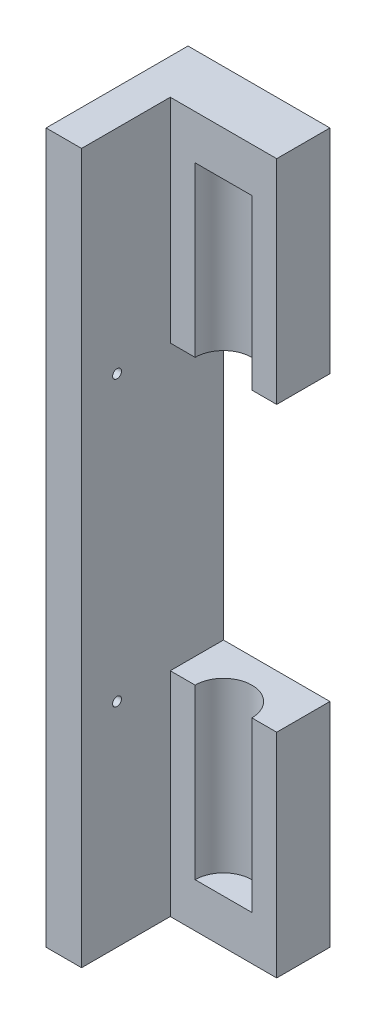
ISO-10303-21;
HEADER;
FILE_DESCRIPTION(('STEP AP214'),'2;1');
FILE_NAME('part.step','',(''),(''),'','','');
FILE_SCHEMA(('AUTOMOTIVE_DESIGN { 1 0 10303 214 1 1 1 1 }'));
ENDSEC;
DATA;
#1=APPLICATION_CONTEXT('core data for automotive mechanical design processes');
#2=APPLICATION_PROTOCOL_DEFINITION('international standard','automotive_design',2000,#1);
#3=PRODUCT_CONTEXT('',#1,'mechanical');
#4=PRODUCT('Part','Part','',(#3));
#5=PRODUCT_RELATED_PRODUCT_CATEGORY('part','',(#4));
#6=PRODUCT_DEFINITION_FORMATION('','',#4);
#7=PRODUCT_DEFINITION_CONTEXT('part definition',#1,'design');
#8=PRODUCT_DEFINITION('design','',#6,#7);
#9=PRODUCT_DEFINITION_SHAPE('','',#8);
#10=(LENGTH_UNIT() NAMED_UNIT(*) SI_UNIT(.MILLI.,.METRE.));
#11=(NAMED_UNIT(*) PLANE_ANGLE_UNIT() SI_UNIT($,.RADIAN.));
#12=(NAMED_UNIT(*) SI_UNIT($,.STERADIAN.) SOLID_ANGLE_UNIT());
#13=UNCERTAINTY_MEASURE_WITH_UNIT(LENGTH_MEASURE(1.E-05),#10,'distance_accuracy_value','');
#14=(GEOMETRIC_REPRESENTATION_CONTEXT(3) GLOBAL_UNCERTAINTY_ASSIGNED_CONTEXT((#13)) GLOBAL_UNIT_ASSIGNED_CONTEXT((#10,
#11,#12)) REPRESENTATION_CONTEXT('',''));
#15=CARTESIAN_POINT('',(0.,0.,0.));
#16=DIRECTION('',(0.,0.,1.));
#17=DIRECTION('',(1.,0.,0.));
#18=AXIS2_PLACEMENT_3D('',#15,#16,#17);
#19=CARTESIAN_POINT('',(30.,200.,0.));
#20=DIRECTION('',(0.,0.,-1.));
#21=DIRECTION('',(-1.,0.,0.));
#22=AXIS2_PLACEMENT_3D('',#19,#20,#21);
#23=PLANE('',#22);
#24=DIRECTION('',(1.,0.,0.));
#25=VECTOR('',#24,1.);
#26=CARTESIAN_POINT('',(30.,140.,0.));
#27=LINE('',#26,#25);
#28=CARTESIAN_POINT('',(23.,140.,0.));
#29=VERTEX_POINT('',#28);
#30=CARTESIAN_POINT('',(30.,140.,0.));
#31=VERTEX_POINT('',#30);
#32=EDGE_CURVE('E53',#29,#31,#27,.T.);
#33=ORIENTED_EDGE('',*,*,#32,.T.);
#34=DIRECTION('',(0.,-1.,0.));
#35=VECTOR('',#34,1.);
#36=CARTESIAN_POINT('',(30.,200.,0.));
#37=LINE('',#36,#35);
#38=CARTESIAN_POINT('',(30.,200.,0.));
#39=VERTEX_POINT('',#38);
#40=EDGE_CURVE('E162',#39,#31,#37,.T.);
#41=ORIENTED_EDGE('',*,*,#40,.F.);
#42=DIRECTION('',(1.,0.,0.));
#43=VECTOR('',#42,1.);
#44=CARTESIAN_POINT('',(30.,200.,0.));
#45=LINE('',#44,#43);
#46=CARTESIAN_POINT('',(0.,200.,0.));
#47=VERTEX_POINT('',#46);
#48=EDGE_CURVE('E206',#47,#39,#45,.T.);
#49=ORIENTED_EDGE('',*,*,#48,.F.);
#50=DIRECTION('',(0.,-1.,0.));
#51=VECTOR('',#50,1.);
#52=CARTESIAN_POINT('',(0.,200.,0.));
#53=LINE('',#52,#51);
#54=CARTESIAN_POINT('',(0.,140.,0.));
#55=VERTEX_POINT('',#54);
#56=EDGE_CURVE('E194',#47,#55,#53,.T.);
#57=ORIENTED_EDGE('',*,*,#56,.T.);
#58=CARTESIAN_POINT('',(7.00000000000001,140.,0.));
#59=VERTEX_POINT('',#58);
#60=EDGE_CURVE('E186',#55,#59,#27,.T.);
#61=ORIENTED_EDGE('',*,*,#60,.T.);
#62=DIRECTION('',(0.,1.,0.));
#63=VECTOR('',#62,1.);
#64=CARTESIAN_POINT('',(7.00000000000001,12.5,0.));
#65=LINE('',#64,#63);
#66=CARTESIAN_POINT('',(7.00000000000001,187.5,0.));
#67=VERTEX_POINT('',#66);
#68=EDGE_CURVE('E177',#59,#67,#65,.T.);
#69=ORIENTED_EDGE('',*,*,#68,.T.);
#70=DIRECTION('',(1.,0.,0.));
#71=VECTOR('',#70,1.);
#72=CARTESIAN_POINT('',(30.,187.5,0.));
#73=LINE('',#72,#71);
#74=CARTESIAN_POINT('',(23.,187.5,0.));
#75=VERTEX_POINT('',#74);
#76=EDGE_CURVE('E166',#67,#75,#73,.T.);
#77=ORIENTED_EDGE('',*,*,#76,.T.);
#78=DIRECTION('',(0.,1.,0.));
#79=VECTOR('',#78,1.);
#80=CARTESIAN_POINT('',(23.,12.5,0.));
#81=LINE('',#80,#79);
#82=EDGE_CURVE('E174',#75,#29,#81,.F.);
#83=ORIENTED_EDGE('',*,*,#82,.T.);
#84=EDGE_LOOP('',(#33,#41,#49,#57,#61,#69,#77,#83));
#85=FACE_BOUND('',#84,.T.);
#86=ADVANCED_FACE('F38',(#85),#23,.F.);
#87=CARTESIAN_POINT('',(30.,200.,-15.));
#88=DIRECTION('',(-1.,0.,0.));
#89=DIRECTION('',(0.,0.,1.));
#90=AXIS2_PLACEMENT_3D('',#87,#88,#89);
#91=PLANE('',#90);
#92=DIRECTION('',(0.,0.,-1.));
#93=VECTOR('',#92,1.);
#94=CARTESIAN_POINT('',(30.,140.,-15.));
#95=LINE('',#94,#93);
#96=CARTESIAN_POINT('',(30.,140.,-15.));
#97=VERTEX_POINT('',#96);
#98=EDGE_CURVE('E195',#31,#97,#95,.T.);
#99=ORIENTED_EDGE('',*,*,#98,.T.);
#100=DIRECTION('',(0.,-1.,0.));
#101=VECTOR('',#100,1.);
#102=CARTESIAN_POINT('',(30.,200.,-15.));
#103=LINE('',#102,#101);
#104=CARTESIAN_POINT('',(30.,200.,-15.));
#105=VERTEX_POINT('',#104);
#106=EDGE_CURVE('E163',#105,#97,#103,.T.);
#107=ORIENTED_EDGE('',*,*,#106,.F.);
#108=DIRECTION('',(0.,0.,-1.));
#109=VECTOR('',#108,1.);
#110=CARTESIAN_POINT('',(30.,200.,-15.));
#111=LINE('',#110,#109);
#112=EDGE_CURVE('E209',#39,#105,#111,.T.);
#113=ORIENTED_EDGE('',*,*,#112,.F.);
#114=ORIENTED_EDGE('',*,*,#40,.T.);
#115=EDGE_LOOP('',(#99,#107,#113,#114));
#116=FACE_BOUND('',#115,.T.);
#117=ADVANCED_FACE('F267',(#116),#91,.F.);
#118=CARTESIAN_POINT('',(15.,12.5,0.));
#119=DIRECTION('',(0.,1.,0.));
#120=DIRECTION('',(0.,0.,1.));
#121=AXIS2_PLACEMENT_3D('',#118,#119,#120);
#122=CYLINDRICAL_SURFACE('',#121,8.);
#123=CARTESIAN_POINT('',(15.,140.,0.));
#124=DIRECTION('',(0.,-1.,0.));
#125=DIRECTION('',(0.,0.,-1.));
#126=AXIS2_PLACEMENT_3D('',#123,#124,#125);
#127=CIRCLE('',#126,8.);
#128=EDGE_CURVE('E46',#29,#59,#127,.F.);
#129=ORIENTED_EDGE('',*,*,#128,.F.);
#130=ORIENTED_EDGE('',*,*,#82,.F.);
#131=CARTESIAN_POINT('',(15.,187.5,0.));
#132=DIRECTION('',(0.,1.,0.));
#133=DIRECTION('',(0.,0.,1.));
#134=AXIS2_PLACEMENT_3D('',#131,#132,#133);
#135=CIRCLE('',#134,8.);
#136=EDGE_CURVE('E60',#75,#67,#135,.T.);
#137=ORIENTED_EDGE('',*,*,#136,.T.);
#138=ORIENTED_EDGE('',*,*,#68,.F.);
#139=EDGE_LOOP('',(#129,#130,#137,#138));
#140=FACE_BOUND('',#139,.T.);
#141=ADVANCED_FACE('F197',(#140),#122,.F.);
#142=CARTESIAN_POINT('',(30.,60.,0.));
#143=VERTEX_POINT('',#142);
#144=CARTESIAN_POINT('',(30.,0.,0.));
#145=VERTEX_POINT('',#144);
#146=EDGE_CURVE('E154',#143,#145,#37,.T.);
#147=ORIENTED_EDGE('',*,*,#146,.F.);
#148=DIRECTION('',(1.,0.,0.));
#149=VECTOR('',#148,1.);
#150=CARTESIAN_POINT('',(30.,60.,0.));
#151=LINE('',#150,#149);
#152=CARTESIAN_POINT('',(23.,60.,0.));
#153=VERTEX_POINT('',#152);
#154=EDGE_CURVE('E139',#153,#143,#151,.T.);
#155=ORIENTED_EDGE('',*,*,#154,.F.);
#156=CARTESIAN_POINT('',(23.,12.5,0.));
#157=VERTEX_POINT('',#156);
#158=EDGE_CURVE('E173',#153,#157,#81,.F.);
#159=ORIENTED_EDGE('',*,*,#158,.T.);
#160=DIRECTION('',(1.,0.,0.));
#161=VECTOR('',#160,1.);
#162=CARTESIAN_POINT('',(30.,12.5,0.));
#163=LINE('',#162,#161);
#164=CARTESIAN_POINT('',(7.00000000000001,12.5,0.));
#165=VERTEX_POINT('',#164);
#166=EDGE_CURVE('E181',#165,#157,#163,.T.);
#167=ORIENTED_EDGE('',*,*,#166,.F.);
#168=CARTESIAN_POINT('',(7.00000000000001,60.,0.));
#169=VERTEX_POINT('',#168);
#170=EDGE_CURVE('E178',#165,#169,#65,.T.);
#171=ORIENTED_EDGE('',*,*,#170,.T.);
#172=CARTESIAN_POINT('',(0.,60.,0.));
#173=VERTEX_POINT('',#172);
#174=EDGE_CURVE('E147',#173,#169,#151,.T.);
#175=ORIENTED_EDGE('',*,*,#174,.F.);
#176=CARTESIAN_POINT('',(0.,0.,0.));
#177=VERTEX_POINT('',#176);
#178=EDGE_CURVE('E220',#173,#177,#53,.T.);
#179=ORIENTED_EDGE('',*,*,#178,.T.);
#180=DIRECTION('',(1.,0.,0.));
#181=VECTOR('',#180,1.);
#182=CARTESIAN_POINT('',(30.,0.,0.));
#183=LINE('',#182,#181);
#184=EDGE_CURVE('E161',#177,#145,#183,.T.);
#185=ORIENTED_EDGE('',*,*,#184,.T.);
#186=EDGE_LOOP('',(#147,#155,#159,#167,#171,#175,#179,#185));
#187=FACE_BOUND('',#186,.T.);
#188=ADVANCED_FACE('F40',(#187),#23,.F.);
#189=CARTESIAN_POINT('',(30.,60.,-15.));
#190=VERTEX_POINT('',#189);
#191=CARTESIAN_POINT('',(30.,0.,-15.));
#192=VERTEX_POINT('',#191);
#193=EDGE_CURVE('E156',#190,#192,#103,.T.);
#194=ORIENTED_EDGE('',*,*,#193,.F.);
#195=DIRECTION('',(0.,0.,-1.));
#196=VECTOR('',#195,1.);
#197=CARTESIAN_POINT('',(30.,60.,-15.));
#198=LINE('',#197,#196);
#199=EDGE_CURVE('E142',#143,#190,#198,.T.);
#200=ORIENTED_EDGE('',*,*,#199,.F.);
#201=ORIENTED_EDGE('',*,*,#146,.T.);
#202=DIRECTION('',(0.,0.,-1.));
#203=VECTOR('',#202,1.);
#204=CARTESIAN_POINT('',(30.,0.,-15.));
#205=LINE('',#204,#203);
#206=EDGE_CURVE('E222',#145,#192,#205,.T.);
#207=ORIENTED_EDGE('',*,*,#206,.T.);
#208=EDGE_LOOP('',(#194,#200,#201,#207));
#209=FACE_BOUND('',#208,.T.);
#210=ADVANCED_FACE('F152',(#209),#91,.F.);
#211=CARTESIAN_POINT('',(-10.,200.,-15.));
#212=DIRECTION('',(0.,0.,1.));
#213=DIRECTION('',(1.,0.,0.));
#214=AXIS2_PLACEMENT_3D('',#211,#212,#213);
#215=PLANE('',#214);
#216=DIRECTION('',(0.,1.,0.));
#217=VECTOR('',#216,1.);
#218=CARTESIAN_POINT('',(0.,60.,-15.));
#219=LINE('',#218,#217);
#220=CARTESIAN_POINT('',(0.,60.,-15.));
#221=VERTEX_POINT('',#220);
#222=CARTESIAN_POINT('',(0.,140.,-15.));
#223=VERTEX_POINT('',#222);
#224=EDGE_CURVE('E199',#221,#223,#219,.T.);
#225=ORIENTED_EDGE('',*,*,#224,.F.);
#226=DIRECTION('',(-1.,0.,0.));
#227=VECTOR('',#226,1.);
#228=CARTESIAN_POINT('',(0.,60.,-15.));
#229=LINE('',#228,#227);
#230=EDGE_CURVE('E157',#190,#221,#229,.T.);
#231=ORIENTED_EDGE('',*,*,#230,.F.);
#232=ORIENTED_EDGE('',*,*,#193,.T.);
#233=DIRECTION('',(-1.,0.,0.));
#234=VECTOR('',#233,1.);
#235=CARTESIAN_POINT('',(-10.,0.,-15.));
#236=LINE('',#235,#234);
#237=CARTESIAN_POINT('',(-10.,0.,-15.));
#238=VERTEX_POINT('',#237);
#239=EDGE_CURVE('E224',#192,#238,#236,.T.);
#240=ORIENTED_EDGE('',*,*,#239,.T.);
#241=DIRECTION('',(0.,-1.,0.));
#242=VECTOR('',#241,1.);
#243=CARTESIAN_POINT('',(-10.,200.,-15.));
#244=LINE('',#243,#242);
#245=CARTESIAN_POINT('',(-10.,200.,-15.));
#246=VERTEX_POINT('',#245);
#247=EDGE_CURVE('E238',#246,#238,#244,.T.);
#248=ORIENTED_EDGE('',*,*,#247,.F.);
#249=DIRECTION('',(-1.,0.,0.));
#250=VECTOR('',#249,1.);
#251=CARTESIAN_POINT('',(-10.,200.,-15.));
#252=LINE('',#251,#250);
#253=EDGE_CURVE('E212',#105,#246,#252,.T.);
#254=ORIENTED_EDGE('',*,*,#253,.F.);
#255=ORIENTED_EDGE('',*,*,#106,.T.);
#256=DIRECTION('',(-1.,0.,0.));
#257=VECTOR('',#256,1.);
#258=CARTESIAN_POINT('',(0.,140.,-15.));
#259=LINE('',#258,#257);
#260=EDGE_CURVE('E264',#97,#223,#259,.T.);
#261=ORIENTED_EDGE('',*,*,#260,.T.);
#262=EDGE_LOOP('',(#225,#231,#232,#240,#248,#254,#255,#261));
#263=FACE_BOUND('',#262,.T.);
#264=ADVANCED_FACE('F246',(#263),#215,.F.);
#265=CARTESIAN_POINT('',(-10.,200.,25.));
#266=DIRECTION('',(1.,0.,0.));
#267=DIRECTION('',(0.,0.,-1.));
#268=AXIS2_PLACEMENT_3D('',#265,#266,#267);
#269=PLANE('',#268);
#270=CARTESIAN_POINT('',(-10.,140.,15.));
#271=DIRECTION('',(1.,0.,0.));
#272=DIRECTION('',(0.,0.,-1.));
#273=AXIS2_PLACEMENT_3D('',#270,#271,#272);
#274=CIRCLE('',#273,1.25);
#275=CARTESIAN_POINT('',(-10.,140.,13.75));
#276=VERTEX_POINT('',#275);
#277=EDGE_CURVE('E286',#276,#276,#274,.T.);
#278=ORIENTED_EDGE('',*,*,#277,.T.);
#279=EDGE_LOOP('',(#278));
#280=FACE_BOUND('',#279,.T.);
#281=CARTESIAN_POINT('',(-10.,60.,15.));
#282=DIRECTION('',(1.,0.,0.));
#283=DIRECTION('',(0.,0.,-1.));
#284=AXIS2_PLACEMENT_3D('',#281,#282,#283);
#285=CIRCLE('',#284,1.25);
#286=CARTESIAN_POINT('',(-10.,60.,13.75));
#287=VERTEX_POINT('',#286);
#288=EDGE_CURVE('E280',#287,#287,#285,.T.);
#289=ORIENTED_EDGE('',*,*,#288,.T.);
#290=EDGE_LOOP('',(#289));
#291=FACE_BOUND('',#290,.T.);
#292=DIRECTION('',(0.,0.,1.));
#293=VECTOR('',#292,1.);
#294=CARTESIAN_POINT('',(-10.,0.,25.));
#295=LINE('',#294,#293);
#296=CARTESIAN_POINT('',(-10.,0.,25.));
#297=VERTEX_POINT('',#296);
#298=EDGE_CURVE('E226',#238,#297,#295,.T.);
#299=ORIENTED_EDGE('',*,*,#298,.T.);
#300=DIRECTION('',(0.,-1.,0.));
#301=VECTOR('',#300,1.);
#302=CARTESIAN_POINT('',(-10.,200.,25.));
#303=LINE('',#302,#301);
#304=CARTESIAN_POINT('',(-10.,200.,25.));
#305=VERTEX_POINT('',#304);
#306=EDGE_CURVE('E236',#305,#297,#303,.T.);
#307=ORIENTED_EDGE('',*,*,#306,.F.);
#308=DIRECTION('',(0.,0.,1.));
#309=VECTOR('',#308,1.);
#310=CARTESIAN_POINT('',(-10.,200.,25.));
#311=LINE('',#310,#309);
#312=EDGE_CURVE('E214',#246,#305,#311,.T.);
#313=ORIENTED_EDGE('',*,*,#312,.F.);
#314=ORIENTED_EDGE('',*,*,#247,.T.);
#315=EDGE_LOOP('',(#299,#307,#313,#314));
#316=FACE_BOUND('',#315,.T.);
#317=ADVANCED_FACE('F253',(#280,#291,#316),#269,.F.);
#318=CARTESIAN_POINT('',(0.,200.,25.));
#319=DIRECTION('',(0.,0.,-1.));
#320=DIRECTION('',(-1.,0.,0.));
#321=AXIS2_PLACEMENT_3D('',#318,#319,#320);
#322=PLANE('',#321);
#323=DIRECTION('',(1.,0.,0.));
#324=VECTOR('',#323,1.);
#325=CARTESIAN_POINT('',(0.,0.,25.));
#326=LINE('',#325,#324);
#327=CARTESIAN_POINT('',(0.,0.,25.));
#328=VERTEX_POINT('',#327);
#329=EDGE_CURVE('E228',#297,#328,#326,.T.);
#330=ORIENTED_EDGE('',*,*,#329,.T.);
#331=DIRECTION('',(0.,-1.,0.));
#332=VECTOR('',#331,1.);
#333=CARTESIAN_POINT('',(0.,200.,25.));
#334=LINE('',#333,#332);
#335=CARTESIAN_POINT('',(0.,200.,25.));
#336=VERTEX_POINT('',#335);
#337=EDGE_CURVE('E233',#336,#328,#334,.T.);
#338=ORIENTED_EDGE('',*,*,#337,.F.);
#339=DIRECTION('',(1.,0.,0.));
#340=VECTOR('',#339,1.);
#341=CARTESIAN_POINT('',(0.,200.,25.));
#342=LINE('',#341,#340);
#343=EDGE_CURVE('E216',#305,#336,#342,.T.);
#344=ORIENTED_EDGE('',*,*,#343,.F.);
#345=ORIENTED_EDGE('',*,*,#306,.T.);
#346=EDGE_LOOP('',(#330,#338,#344,#345));
#347=FACE_BOUND('',#346,.T.);
#348=ADVANCED_FACE('F256',(#347),#322,.F.);
#349=CARTESIAN_POINT('',(0.,200.,0.));
#350=DIRECTION('',(-1.,0.,0.));
#351=DIRECTION('',(0.,0.,1.));
#352=AXIS2_PLACEMENT_3D('',#349,#350,#351);
#353=PLANE('',#352);
#354=CARTESIAN_POINT('',(0.,140.,15.));
#355=DIRECTION('',(1.,0.,0.));
#356=DIRECTION('',(0.,0.,-1.));
#357=AXIS2_PLACEMENT_3D('',#354,#355,#356);
#358=CIRCLE('',#357,1.24999999999997);
#359=CARTESIAN_POINT('',(0.,140.,13.75));
#360=VERTEX_POINT('',#359);
#361=EDGE_CURVE('E289',#360,#360,#358,.T.);
#362=ORIENTED_EDGE('',*,*,#361,.F.);
#363=EDGE_LOOP('',(#362));
#364=FACE_BOUND('',#363,.T.);
#365=CARTESIAN_POINT('',(0.,60.,15.));
#366=DIRECTION('',(1.,0.,0.));
#367=DIRECTION('',(0.,0.,-1.));
#368=AXIS2_PLACEMENT_3D('',#365,#366,#367);
#369=CIRCLE('',#368,1.24999999999999);
#370=CARTESIAN_POINT('',(0.,60.,13.75));
#371=VERTEX_POINT('',#370);
#372=EDGE_CURVE('E283',#371,#371,#369,.T.);
#373=ORIENTED_EDGE('',*,*,#372,.F.);
#374=EDGE_LOOP('',(#373));
#375=FACE_BOUND('',#374,.T.);
#376=DIRECTION('',(0.,0.,-1.));
#377=VECTOR('',#376,1.);
#378=CARTESIAN_POINT('',(0.,0.,0.));
#379=LINE('',#378,#377);
#380=EDGE_CURVE('E210',#328,#177,#379,.T.);
#381=ORIENTED_EDGE('',*,*,#380,.T.);
#382=ORIENTED_EDGE('',*,*,#178,.F.);
#383=DIRECTION('',(0.,0.,1.));
#384=VECTOR('',#383,1.);
#385=CARTESIAN_POINT('',(0.,60.,0.));
#386=LINE('',#385,#384);
#387=EDGE_CURVE('E203',#221,#173,#386,.T.);
#388=ORIENTED_EDGE('',*,*,#387,.F.);
#389=ORIENTED_EDGE('',*,*,#224,.T.);
#390=DIRECTION('',(0.,0.,1.));
#391=VECTOR('',#390,1.);
#392=CARTESIAN_POINT('',(0.,140.,0.));
#393=LINE('',#392,#391);
#394=EDGE_CURVE('E148',#223,#55,#393,.T.);
#395=ORIENTED_EDGE('',*,*,#394,.T.);
#396=ORIENTED_EDGE('',*,*,#56,.F.);
#397=DIRECTION('',(0.,0.,-1.));
#398=VECTOR('',#397,1.);
#399=CARTESIAN_POINT('',(0.,200.,0.));
#400=LINE('',#399,#398);
#401=EDGE_CURVE('E218',#336,#47,#400,.T.);
#402=ORIENTED_EDGE('',*,*,#401,.F.);
#403=ORIENTED_EDGE('',*,*,#337,.T.);
#404=EDGE_LOOP('',(#381,#382,#388,#389,#395,#396,#402,#403));
#405=FACE_BOUND('',#404,.T.);
#406=ADVANCED_FACE('F274',(#364,#375,#405),#353,.F.);
#407=CARTESIAN_POINT('',(0.,200.,0.));
#408=DIRECTION('',(0.,1.,0.));
#409=DIRECTION('',(0.,0.,1.));
#410=AXIS2_PLACEMENT_3D('',#407,#408,#409);
#411=PLANE('',#410);
#412=ORIENTED_EDGE('',*,*,#48,.T.);
#413=ORIENTED_EDGE('',*,*,#112,.T.);
#414=ORIENTED_EDGE('',*,*,#253,.T.);
#415=ORIENTED_EDGE('',*,*,#312,.T.);
#416=ORIENTED_EDGE('',*,*,#343,.T.);
#417=ORIENTED_EDGE('',*,*,#401,.T.);
#418=EDGE_LOOP('',(#412,#413,#414,#415,#416,#417));
#419=FACE_BOUND('',#418,.T.);
#420=ADVANCED_FACE('F260',(#419),#411,.T.);
#421=CARTESIAN_POINT('',(0.,0.,0.));
#422=DIRECTION('',(0.,1.,0.));
#423=DIRECTION('',(0.,0.,1.));
#424=AXIS2_PLACEMENT_3D('',#421,#422,#423);
#425=PLANE('',#424);
#426=ORIENTED_EDGE('',*,*,#184,.F.);
#427=ORIENTED_EDGE('',*,*,#380,.F.);
#428=ORIENTED_EDGE('',*,*,#329,.F.);
#429=ORIENTED_EDGE('',*,*,#298,.F.);
#430=ORIENTED_EDGE('',*,*,#239,.F.);
#431=ORIENTED_EDGE('',*,*,#206,.F.);
#432=EDGE_LOOP('',(#426,#427,#428,#429,#430,#431));
#433=FACE_BOUND('',#432,.T.);
#434=ADVANCED_FACE('F249',(#433),#425,.F.);
#435=ORIENTED_EDGE('',*,*,#158,.F.);
#436=CARTESIAN_POINT('',(15.,60.,0.));
#437=DIRECTION('',(0.,-1.,0.));
#438=DIRECTION('',(0.,0.,-1.));
#439=AXIS2_PLACEMENT_3D('',#436,#437,#438);
#440=CIRCLE('',#439,8.);
#441=EDGE_CURVE('E11',#153,#169,#440,.F.);
#442=ORIENTED_EDGE('',*,*,#441,.T.);
#443=ORIENTED_EDGE('',*,*,#170,.F.);
#444=CARTESIAN_POINT('',(15.,12.5,0.));
#445=DIRECTION('',(0.,1.,0.));
#446=DIRECTION('',(0.,0.,1.));
#447=AXIS2_PLACEMENT_3D('',#444,#445,#446);
#448=CIRCLE('',#447,8.);
#449=EDGE_CURVE('E198',#157,#165,#448,.T.);
#450=ORIENTED_EDGE('',*,*,#449,.F.);
#451=EDGE_LOOP('',(#435,#442,#443,#450));
#452=FACE_BOUND('',#451,.T.);
#453=ADVANCED_FACE('F323',(#452),#122,.F.);
#454=CARTESIAN_POINT('',(15.,12.5,0.));
#455=DIRECTION('',(0.,1.,0.));
#456=DIRECTION('',(0.,0.,1.));
#457=AXIS2_PLACEMENT_3D('',#454,#455,#456);
#458=PLANE('',#457);
#459=ORIENTED_EDGE('',*,*,#166,.T.);
#460=ORIENTED_EDGE('',*,*,#449,.T.);
#461=EDGE_LOOP('',(#459,#460));
#462=FACE_BOUND('',#461,.T.);
#463=ADVANCED_FACE('F329',(#462),#458,.T.);
#464=CARTESIAN_POINT('',(15.,187.5,0.));
#465=DIRECTION('',(0.,1.,0.));
#466=DIRECTION('',(0.,0.,1.));
#467=AXIS2_PLACEMENT_3D('',#464,#465,#466);
#468=PLANE('',#467);
#469=ORIENTED_EDGE('',*,*,#136,.F.);
#470=ORIENTED_EDGE('',*,*,#76,.F.);
#471=EDGE_LOOP('',(#469,#470));
#472=FACE_BOUND('',#471,.T.);
#473=ADVANCED_FACE('F335',(#472),#468,.F.);
#474=CARTESIAN_POINT('',(0.,60.,0.));
#475=DIRECTION('',(0.,-1.,0.));
#476=DIRECTION('',(0.,0.,-1.));
#477=AXIS2_PLACEMENT_3D('',#474,#475,#476);
#478=PLANE('',#477);
#479=ORIENTED_EDGE('',*,*,#154,.T.);
#480=ORIENTED_EDGE('',*,*,#199,.T.);
#481=ORIENTED_EDGE('',*,*,#230,.T.);
#482=ORIENTED_EDGE('',*,*,#387,.T.);
#483=ORIENTED_EDGE('',*,*,#174,.T.);
#484=ORIENTED_EDGE('',*,*,#441,.F.);
#485=EDGE_LOOP('',(#479,#480,#481,#482,#483,#484));
#486=FACE_BOUND('',#485,.T.);
#487=ADVANCED_FACE('F141',(#486),#478,.F.);
#488=CARTESIAN_POINT('',(0.,140.,0.));
#489=DIRECTION('',(0.,-1.,0.));
#490=DIRECTION('',(0.,0.,-1.));
#491=AXIS2_PLACEMENT_3D('',#488,#489,#490);
#492=PLANE('',#491);
#493=ORIENTED_EDGE('',*,*,#128,.T.);
#494=ORIENTED_EDGE('',*,*,#60,.F.);
#495=ORIENTED_EDGE('',*,*,#394,.F.);
#496=ORIENTED_EDGE('',*,*,#260,.F.);
#497=ORIENTED_EDGE('',*,*,#98,.F.);
#498=ORIENTED_EDGE('',*,*,#32,.F.);
#499=EDGE_LOOP('',(#493,#494,#495,#496,#497,#498));
#500=FACE_BOUND('',#499,.T.);
#501=ADVANCED_FACE('F184',(#500),#492,.T.);
#502=CARTESIAN_POINT('',(0.,60.,15.));
#503=DIRECTION('',(1.,0.,0.));
#504=DIRECTION('',(0.,0.,-1.));
#505=AXIS2_PLACEMENT_3D('',#502,#503,#504);
#506=CYLINDRICAL_SURFACE('',#505,1.24999999999999);
#507=ORIENTED_EDGE('',*,*,#288,.F.);
#508=EDGE_LOOP('',(#507));
#509=FACE_BOUND('',#508,.T.);
#510=ORIENTED_EDGE('',*,*,#372,.T.);
#511=EDGE_LOOP('',(#510));
#512=FACE_BOUND('',#511,.T.);
#513=ADVANCED_FACE('F300',(#509,#512),#506,.F.);
#514=CARTESIAN_POINT('',(0.,140.,15.));
#515=DIRECTION('',(1.,0.,0.));
#516=DIRECTION('',(0.,0.,-1.));
#517=AXIS2_PLACEMENT_3D('',#514,#515,#516);
#518=CYLINDRICAL_SURFACE('',#517,1.24999999999999);
#519=ORIENTED_EDGE('',*,*,#277,.F.);
#520=EDGE_LOOP('',(#519));
#521=FACE_BOUND('',#520,.T.);
#522=ORIENTED_EDGE('',*,*,#361,.T.);
#523=EDGE_LOOP('',(#522));
#524=FACE_BOUND('',#523,.T.);
#525=ADVANCED_FACE('F293',(#521,#524),#518,.F.);
#526=CLOSED_SHELL('',(#86,#117,#141,#188,#210,#264,#317,#348,#406,#420,#434,#453,#463,#473,#487,
#501,#513,#525));
#527=MANIFOLD_SOLID_BREP('B2',#526);
#528=ADVANCED_BREP_SHAPE_REPRESENTATION('',(#18,#527),#14);
#529=SHAPE_DEFINITION_REPRESENTATION(#9,#528);
ENDSEC;
END-ISO-10303-21;
